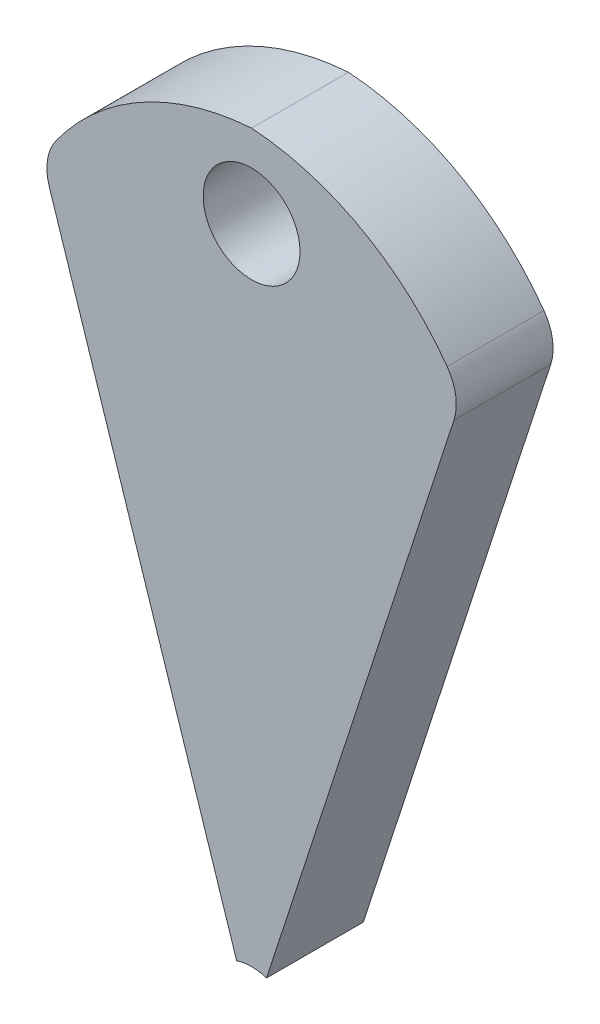
ISO-10303-21;
HEADER;
FILE_DESCRIPTION(('STEP AP214'),'2;1');
FILE_NAME('part.step','',(''),(''),'','','');
FILE_SCHEMA(('AUTOMOTIVE_DESIGN { 1 0 10303 214 1 1 1 1 }'));
ENDSEC;
DATA;
#1=APPLICATION_CONTEXT('core data for automotive mechanical design processes');
#2=APPLICATION_PROTOCOL_DEFINITION('international standard','automotive_design',2000,#1);
#3=PRODUCT_CONTEXT('',#1,'mechanical');
#4=PRODUCT('Part','Part','',(#3));
#5=PRODUCT_RELATED_PRODUCT_CATEGORY('part','',(#4));
#6=PRODUCT_DEFINITION_FORMATION('','',#4);
#7=PRODUCT_DEFINITION_CONTEXT('part definition',#1,'design');
#8=PRODUCT_DEFINITION('design','',#6,#7);
#9=PRODUCT_DEFINITION_SHAPE('','',#8);
#10=(LENGTH_UNIT() NAMED_UNIT(*) SI_UNIT(.MILLI.,.METRE.));
#11=(NAMED_UNIT(*) PLANE_ANGLE_UNIT() SI_UNIT($,.RADIAN.));
#12=(NAMED_UNIT(*) SI_UNIT($,.STERADIAN.) SOLID_ANGLE_UNIT());
#13=UNCERTAINTY_MEASURE_WITH_UNIT(LENGTH_MEASURE(1.E-05),#10,'distance_accuracy_value','');
#14=(GEOMETRIC_REPRESENTATION_CONTEXT(3) GLOBAL_UNCERTAINTY_ASSIGNED_CONTEXT((#13)) GLOBAL_UNIT_ASSIGNED_CONTEXT((#10,
#11,#12)) REPRESENTATION_CONTEXT('',''));
#15=CARTESIAN_POINT('',(0.,0.,0.));
#16=DIRECTION('',(0.,0.,1.));
#17=DIRECTION('',(1.,0.,0.));
#18=AXIS2_PLACEMENT_3D('',#15,#16,#17);
#19=CARTESIAN_POINT('',(12.1057873224374,508.853560240207,53.3781366448785));
#20=DIRECTION('',(0.,0.,-1.));
#21=DIRECTION('',(-1.,0.,0.));
#22=AXIS2_PLACEMENT_3D('',#19,#20,#21);
#23=PLANE('',#22);
#24=CARTESIAN_POINT('',(12.1057873224374,508.853560240207,53.3781366448785));
#25=DIRECTION('',(0.,0.,1.));
#26=DIRECTION('',(-1.,0.,0.));
#27=AXIS2_PLACEMENT_3D('',#24,#25,#26);
#28=CIRCLE('',#27,3.75);
#29=CARTESIAN_POINT('',(15.6722492585442,507.694746511301,53.3781366448785));
#30=VERTEX_POINT('',#29);
#31=CARTESIAN_POINT('',(15.1476526558998,511.046630073358,53.3781366448785));
#32=VERTEX_POINT('',#31);
#33=EDGE_CURVE('E160',#30,#32,#28,.T.);
#34=ORIENTED_EDGE('',*,*,#33,.T.);
#35=CARTESIAN_POINT('',(-1.38283151712811,499.128776324721,53.3781366448785));
#36=DIRECTION('',(0.,0.,1.));
#37=DIRECTION('',(1.,0.,0.));
#38=AXIS2_PLACEMENT_3D('',#35,#36,#37);
#39=CIRCLE('',#38,20.3787179422221);
#40=CARTESIAN_POINT('',(0.,519.460522977772,53.3781366448785));
#41=VERTEX_POINT('',#40);
#42=EDGE_CURVE('E102',#32,#41,#39,.T.);
#43=ORIENTED_EDGE('',*,*,#42,.T.);
#44=CARTESIAN_POINT('',(1.38283151712811,499.128776324721,53.3781366448785));
#45=DIRECTION('',(0.,0.,1.));
#46=DIRECTION('',(-1.,0.,0.));
#47=AXIS2_PLACEMENT_3D('',#44,#45,#46);
#48=CIRCLE('',#47,20.3787179422221);
#49=CARTESIAN_POINT('',(-15.1476526558998,511.046630073358,53.3781366448785));
#50=VERTEX_POINT('',#49);
#51=EDGE_CURVE('E192',#41,#50,#48,.T.);
#52=ORIENTED_EDGE('',*,*,#51,.T.);
#53=CARTESIAN_POINT('',(-12.1057873224373,508.853560240207,53.3781366448785));
#54=DIRECTION('',(0.,0.,1.));
#55=DIRECTION('',(1.,0.,0.));
#56=AXIS2_PLACEMENT_3D('',#53,#54,#55);
#57=CIRCLE('',#56,3.75);
#58=CARTESIAN_POINT('',(-15.6722492585442,507.694746511301,53.3781366448785));
#59=VERTEX_POINT('',#58);
#60=EDGE_CURVE('E118',#50,#59,#57,.T.);
#61=ORIENTED_EDGE('',*,*,#60,.T.);
#62=DIRECTION('',(0.309016994374948,-0.951056516295153,0.));
#63=VECTOR('',#62,1.);
#64=CARTESIAN_POINT('',(-1.15881372890605,463.026984913879,53.3781366448785));
#65=LINE('',#64,#63);
#66=CARTESIAN_POINT('',(-1.15881372890605,463.026984913879,53.3781366448785));
#67=VERTEX_POINT('',#66);
#68=EDGE_CURVE('E112',#59,#67,#65,.T.);
#69=ORIENTED_EDGE('',*,*,#68,.T.);
#70=CARTESIAN_POINT('',(0.,459.460522977772,53.3781366448785));
#71=DIRECTION('',(0.,0.,-1.));
#72=DIRECTION('',(1.,0.,0.));
#73=AXIS2_PLACEMENT_3D('',#70,#71,#72);
#74=CIRCLE('',#73,3.75);
#75=CARTESIAN_POINT('',(1.15881372890606,463.026984913879,53.3781366448785));
#76=VERTEX_POINT('',#75);
#77=EDGE_CURVE('E116',#67,#76,#74,.T.);
#78=ORIENTED_EDGE('',*,*,#77,.T.);
#79=DIRECTION('',(0.309016994374948,0.951056516295153,0.));
#80=VECTOR('',#79,1.);
#81=CARTESIAN_POINT('',(1.15881372890606,463.026984913879,53.3781366448785));
#82=LINE('',#81,#80);
#83=EDGE_CURVE('E61',#76,#30,#82,.T.);
#84=ORIENTED_EDGE('',*,*,#83,.T.);
#85=EDGE_LOOP('',(#34,#43,#52,#61,#69,#78,#84));
#86=FACE_BOUND('',#85,.T.);
#87=CARTESIAN_POINT('',(0.,513.039772977772,53.3781366448785));
#88=DIRECTION('',(0.,0.,1.));
#89=DIRECTION('',(1.,0.,0.));
#90=AXIS2_PLACEMENT_3D('',#87,#88,#89);
#91=CIRCLE('',#90,3.75);
#92=CARTESIAN_POINT('',(3.75,513.039772977772,53.3781366448785));
#93=VERTEX_POINT('',#92);
#94=EDGE_CURVE('E145',#93,#93,#91,.T.);
#95=ORIENTED_EDGE('',*,*,#94,.F.);
#96=EDGE_LOOP('',(#95));
#97=FACE_BOUND('',#96,.T.);
#98=ADVANCED_FACE('F43',(#86,#97),#23,.F.);
#99=CARTESIAN_POINT('',(12.1057873224374,508.853560240207,45.8781366448785));
#100=DIRECTION('',(0.,0.,-1.));
#101=DIRECTION('',(-1.,0.,0.));
#102=AXIS2_PLACEMENT_3D('',#99,#100,#101);
#103=PLANE('',#102);
#104=CARTESIAN_POINT('',(0.,506.710522977772,45.8781366448785));
#105=DIRECTION('',(0.,0.,-1.));
#106=DIRECTION('',(-1.,0.,0.));
#107=AXIS2_PLACEMENT_3D('',#104,#105,#106);
#108=CIRCLE('',#107,1.125);
#109=CARTESIAN_POINT('',(-1.125,506.710522977772,45.8781366448785));
#110=VERTEX_POINT('',#109);
#111=EDGE_CURVE('E11',#110,#110,#108,.T.);
#112=ORIENTED_EDGE('',*,*,#111,.F.);
#113=EDGE_LOOP('',(#112));
#114=FACE_BOUND('',#113,.T.);
#115=CARTESIAN_POINT('',(12.1057873224374,508.853560240207,45.8781366448785));
#116=DIRECTION('',(0.,0.,1.));
#117=DIRECTION('',(-1.,0.,0.));
#118=AXIS2_PLACEMENT_3D('',#115,#116,#117);
#119=CIRCLE('',#118,3.75);
#120=CARTESIAN_POINT('',(15.6722492585442,507.694746511301,45.8781366448785));
#121=VERTEX_POINT('',#120);
#122=CARTESIAN_POINT('',(15.1476526558998,511.046630073358,45.8781366448785));
#123=VERTEX_POINT('',#122);
#124=EDGE_CURVE('E140',#121,#123,#119,.T.);
#125=ORIENTED_EDGE('',*,*,#124,.F.);
#126=DIRECTION('',(0.309016994374948,0.951056516295153,0.));
#127=VECTOR('',#126,1.);
#128=CARTESIAN_POINT('',(1.15881372890606,463.026984913879,45.8781366448785));
#129=LINE('',#128,#127);
#130=CARTESIAN_POINT('',(1.15881372890606,463.026984913879,45.8781366448785));
#131=VERTEX_POINT('',#130);
#132=EDGE_CURVE('E93',#131,#121,#129,.T.);
#133=ORIENTED_EDGE('',*,*,#132,.F.);
#134=CARTESIAN_POINT('',(0.,459.460522977772,45.8781366448785));
#135=DIRECTION('',(0.,0.,-1.));
#136=DIRECTION('',(1.,0.,0.));
#137=AXIS2_PLACEMENT_3D('',#134,#135,#136);
#138=CIRCLE('',#137,3.75);
#139=CARTESIAN_POINT('',(-1.15881372890605,463.026984913879,45.8781366448785));
#140=VERTEX_POINT('',#139);
#141=EDGE_CURVE('E87',#140,#131,#138,.T.);
#142=ORIENTED_EDGE('',*,*,#141,.F.);
#143=DIRECTION('',(0.309016994374948,-0.951056516295153,0.));
#144=VECTOR('',#143,1.);
#145=CARTESIAN_POINT('',(-1.15881372890605,463.026984913879,45.8781366448785));
#146=LINE('',#145,#144);
#147=CARTESIAN_POINT('',(-15.6722492585442,507.694746511301,45.8781366448785));
#148=VERTEX_POINT('',#147);
#149=EDGE_CURVE('E127',#148,#140,#146,.T.);
#150=ORIENTED_EDGE('',*,*,#149,.F.);
#151=CARTESIAN_POINT('',(-12.1057873224373,508.853560240207,45.8781366448785));
#152=DIRECTION('',(0.,0.,1.));
#153=DIRECTION('',(1.,0.,0.));
#154=AXIS2_PLACEMENT_3D('',#151,#152,#153);
#155=CIRCLE('',#154,3.75);
#156=CARTESIAN_POINT('',(-15.1476526558998,511.046630073358,45.8781366448785));
#157=VERTEX_POINT('',#156);
#158=EDGE_CURVE('E151',#157,#148,#155,.T.);
#159=ORIENTED_EDGE('',*,*,#158,.F.);
#160=CARTESIAN_POINT('',(1.38283151712811,499.128776324721,45.8781366448785));
#161=DIRECTION('',(0.,0.,1.));
#162=DIRECTION('',(-1.,0.,0.));
#163=AXIS2_PLACEMENT_3D('',#160,#161,#162);
#164=CIRCLE('',#163,20.3787179422221);
#165=CARTESIAN_POINT('',(0.,519.460522977772,45.8781366448785));
#166=VERTEX_POINT('',#165);
#167=EDGE_CURVE('E148',#166,#157,#164,.T.);
#168=ORIENTED_EDGE('',*,*,#167,.F.);
#169=CARTESIAN_POINT('',(-1.38283151712811,499.128776324721,45.8781366448785));
#170=DIRECTION('',(0.,0.,1.));
#171=DIRECTION('',(1.,0.,0.));
#172=AXIS2_PLACEMENT_3D('',#169,#170,#171);
#173=CIRCLE('',#172,20.3787179422221);
#174=EDGE_CURVE('E144',#123,#166,#173,.T.);
#175=ORIENTED_EDGE('',*,*,#174,.F.);
#176=EDGE_LOOP('',(#125,#133,#142,#150,#159,#168,#175));
#177=FACE_BOUND('',#176,.T.);
#178=CARTESIAN_POINT('',(0.,513.039772977772,45.8781366448785));
#179=DIRECTION('',(0.,0.,1.));
#180=DIRECTION('',(1.,0.,0.));
#181=AXIS2_PLACEMENT_3D('',#178,#179,#180);
#182=CIRCLE('',#181,3.75);
#183=CARTESIAN_POINT('',(3.75,513.039772977772,45.8781366448785));
#184=VERTEX_POINT('',#183);
#185=EDGE_CURVE('E200',#184,#184,#182,.T.);
#186=ORIENTED_EDGE('',*,*,#185,.T.);
#187=EDGE_LOOP('',(#186));
#188=FACE_BOUND('',#187,.T.);
#189=ADVANCED_FACE('F181',(#114,#177,#188),#103,.T.);
#190=CARTESIAN_POINT('',(12.1057873224374,508.853560240207,53.3781366448785));
#191=DIRECTION('',(0.,0.,-1.));
#192=DIRECTION('',(-1.,0.,0.));
#193=AXIS2_PLACEMENT_3D('',#190,#191,#192);
#194=CYLINDRICAL_SURFACE('',#193,3.75);
#195=ORIENTED_EDGE('',*,*,#124,.T.);
#196=DIRECTION('',(0.,0.,-1.));
#197=VECTOR('',#196,1.);
#198=CARTESIAN_POINT('',(15.1476526558998,511.046630073358,53.3781366448785));
#199=LINE('',#198,#197);
#200=EDGE_CURVE('E53',#32,#123,#199,.T.);
#201=ORIENTED_EDGE('',*,*,#200,.F.);
#202=ORIENTED_EDGE('',*,*,#33,.F.);
#203=DIRECTION('',(0.,0.,-1.));
#204=VECTOR('',#203,1.);
#205=CARTESIAN_POINT('',(15.6722492585442,507.694746511301,53.3781366448785));
#206=LINE('',#205,#204);
#207=EDGE_CURVE('E136',#30,#121,#206,.T.);
#208=ORIENTED_EDGE('',*,*,#207,.T.);
#209=EDGE_LOOP('',(#195,#201,#202,#208));
#210=FACE_BOUND('',#209,.T.);
#211=ADVANCED_FACE('F45',(#210),#194,.T.);
#212=CARTESIAN_POINT('',(-1.38283151712811,499.128776324721,53.3781366448785));
#213=DIRECTION('',(0.,0.,-1.));
#214=DIRECTION('',(-1.,0.,0.));
#215=AXIS2_PLACEMENT_3D('',#212,#213,#214);
#216=CYLINDRICAL_SURFACE('',#215,20.3787179422221);
#217=ORIENTED_EDGE('',*,*,#174,.T.);
#218=DIRECTION('',(0.,0.,-1.));
#219=VECTOR('',#218,1.);
#220=CARTESIAN_POINT('',(0.,519.460522977772,53.3781366448785));
#221=LINE('',#220,#219);
#222=EDGE_CURVE('E171',#41,#166,#221,.T.);
#223=ORIENTED_EDGE('',*,*,#222,.F.);
#224=ORIENTED_EDGE('',*,*,#42,.F.);
#225=ORIENTED_EDGE('',*,*,#200,.T.);
#226=EDGE_LOOP('',(#217,#223,#224,#225));
#227=FACE_BOUND('',#226,.T.);
#228=ADVANCED_FACE('F176',(#227),#216,.T.);
#229=CARTESIAN_POINT('',(1.38283151712811,499.128776324721,53.3781366448785));
#230=DIRECTION('',(0.,0.,-1.));
#231=DIRECTION('',(-1.,0.,0.));
#232=AXIS2_PLACEMENT_3D('',#229,#230,#231);
#233=CYLINDRICAL_SURFACE('',#232,20.3787179422221);
#234=ORIENTED_EDGE('',*,*,#167,.T.);
#235=DIRECTION('',(0.,0.,-1.));
#236=VECTOR('',#235,1.);
#237=CARTESIAN_POINT('',(-15.1476526558998,511.046630073358,53.3781366448785));
#238=LINE('',#237,#236);
#239=EDGE_CURVE('E167',#50,#157,#238,.T.);
#240=ORIENTED_EDGE('',*,*,#239,.F.);
#241=ORIENTED_EDGE('',*,*,#51,.F.);
#242=ORIENTED_EDGE('',*,*,#222,.T.);
#243=EDGE_LOOP('',(#234,#240,#241,#242));
#244=FACE_BOUND('',#243,.T.);
#245=ADVANCED_FACE('F187',(#244),#233,.T.);
#246=CARTESIAN_POINT('',(-12.1057873224373,508.853560240207,53.3781366448785));
#247=DIRECTION('',(0.,0.,-1.));
#248=DIRECTION('',(-1.,0.,0.));
#249=AXIS2_PLACEMENT_3D('',#246,#247,#248);
#250=CYLINDRICAL_SURFACE('',#249,3.75);
#251=ORIENTED_EDGE('',*,*,#158,.T.);
#252=DIRECTION('',(0.,0.,-1.));
#253=VECTOR('',#252,1.);
#254=CARTESIAN_POINT('',(-15.6722492585442,507.694746511301,53.3781366448785));
#255=LINE('',#254,#253);
#256=EDGE_CURVE('E129',#59,#148,#255,.T.);
#257=ORIENTED_EDGE('',*,*,#256,.F.);
#258=ORIENTED_EDGE('',*,*,#60,.F.);
#259=ORIENTED_EDGE('',*,*,#239,.T.);
#260=EDGE_LOOP('',(#251,#257,#258,#259));
#261=FACE_BOUND('',#260,.T.);
#262=ADVANCED_FACE('F190',(#261),#250,.T.);
#263=CARTESIAN_POINT('',(-1.15881372890605,463.026984913879,53.3781366448785));
#264=DIRECTION('',(0.951056516295153,0.309016994374948,0.));
#265=DIRECTION('',(-0.309016994374948,0.951056516295153,0.));
#266=AXIS2_PLACEMENT_3D('',#263,#264,#265);
#267=PLANE('',#266);
#268=ORIENTED_EDGE('',*,*,#149,.T.);
#269=DIRECTION('',(0.,0.,-1.));
#270=VECTOR('',#269,1.);
#271=CARTESIAN_POINT('',(-1.15881372890605,463.026984913879,53.3781366448785));
#272=LINE('',#271,#270);
#273=EDGE_CURVE('E124',#67,#140,#272,.T.);
#274=ORIENTED_EDGE('',*,*,#273,.F.);
#275=ORIENTED_EDGE('',*,*,#68,.F.);
#276=ORIENTED_EDGE('',*,*,#256,.T.);
#277=EDGE_LOOP('',(#268,#274,#275,#276));
#278=FACE_BOUND('',#277,.T.);
#279=ADVANCED_FACE('F125',(#278),#267,.F.);
#280=CARTESIAN_POINT('',(0.,459.460522977772,53.3781366448785));
#281=DIRECTION('',(0.,0.,-1.));
#282=DIRECTION('',(-1.,0.,0.));
#283=AXIS2_PLACEMENT_3D('',#280,#281,#282);
#284=CYLINDRICAL_SURFACE('',#283,3.75);
#285=ORIENTED_EDGE('',*,*,#141,.T.);
#286=DIRECTION('',(0.,0.,-1.));
#287=VECTOR('',#286,1.);
#288=CARTESIAN_POINT('',(1.15881372890606,463.026984913879,53.3781366448785));
#289=LINE('',#288,#287);
#290=EDGE_CURVE('E130',#76,#131,#289,.T.);
#291=ORIENTED_EDGE('',*,*,#290,.F.);
#292=ORIENTED_EDGE('',*,*,#77,.F.);
#293=ORIENTED_EDGE('',*,*,#273,.T.);
#294=EDGE_LOOP('',(#285,#291,#292,#293));
#295=FACE_BOUND('',#294,.T.);
#296=ADVANCED_FACE('F132',(#295),#284,.F.);
#297=CARTESIAN_POINT('',(1.15881372890606,463.026984913879,53.3781366448785));
#298=DIRECTION('',(-0.951056516295153,0.309016994374948,0.));
#299=DIRECTION('',(-0.309016994374948,-0.951056516295153,0.));
#300=AXIS2_PLACEMENT_3D('',#297,#298,#299);
#301=PLANE('',#300);
#302=ORIENTED_EDGE('',*,*,#132,.T.);
#303=ORIENTED_EDGE('',*,*,#207,.F.);
#304=ORIENTED_EDGE('',*,*,#83,.F.);
#305=ORIENTED_EDGE('',*,*,#290,.T.);
#306=EDGE_LOOP('',(#302,#303,#304,#305));
#307=FACE_BOUND('',#306,.T.);
#308=ADVANCED_FACE('F232',(#307),#301,.F.);
#309=CARTESIAN_POINT('',(0.,513.039772977772,53.3781366448785));
#310=DIRECTION('',(0.,0.,-1.));
#311=DIRECTION('',(-1.,0.,0.));
#312=AXIS2_PLACEMENT_3D('',#309,#310,#311);
#313=CYLINDRICAL_SURFACE('',#312,3.75);
#314=ORIENTED_EDGE('',*,*,#94,.T.);
#315=EDGE_LOOP('',(#314));
#316=FACE_BOUND('',#315,.T.);
#317=ORIENTED_EDGE('',*,*,#185,.F.);
#318=EDGE_LOOP('',(#317));
#319=FACE_BOUND('',#318,.T.);
#320=ADVANCED_FACE('F221',(#316,#319),#313,.F.);
#321=CARTESIAN_POINT('',(0.,506.710522977772,38.3781366448785));
#322=DIRECTION('',(0.,0.,1.));
#323=DIRECTION('',(1.,0.,0.));
#324=AXIS2_PLACEMENT_3D('',#321,#322,#323);
#325=CYLINDRICAL_SURFACE('',#324,1.125);
#326=CARTESIAN_POINT('',(0.,506.710522977772,38.3781366448785));
#327=DIRECTION('',(0.,0.,1.));
#328=DIRECTION('',(1.,0.,0.));
#329=AXIS2_PLACEMENT_3D('',#326,#327,#328);
#330=CIRCLE('',#329,1.125);
#331=CARTESIAN_POINT('',(1.125,506.710522977772,38.3781366448785));
#332=VERTEX_POINT('',#331);
#333=EDGE_CURVE('E204',#332,#332,#330,.T.);
#334=ORIENTED_EDGE('',*,*,#333,.T.);
#335=EDGE_LOOP('',(#334));
#336=FACE_BOUND('',#335,.T.);
#337=ORIENTED_EDGE('',*,*,#111,.T.);
#338=EDGE_LOOP('',(#337));
#339=FACE_BOUND('',#338,.T.);
#340=ADVANCED_FACE('F212',(#336,#339),#325,.T.);
#341=CARTESIAN_POINT('',(0.,506.710522977772,38.3781366448785));
#342=DIRECTION('',(0.,0.,1.));
#343=DIRECTION('',(1.,0.,0.));
#344=AXIS2_PLACEMENT_3D('',#341,#342,#343);
#345=PLANE('',#344);
#346=ORIENTED_EDGE('',*,*,#333,.F.);
#347=EDGE_LOOP('',(#346));
#348=FACE_BOUND('',#347,.T.);
#349=ADVANCED_FACE('F215',(#348),#345,.F.);
#350=CLOSED_SHELL('',(#98,#189,#211,#228,#245,#262,#279,#296,#308,#320,#340,#349));
#351=MANIFOLD_SOLID_BREP('B2',#350);
#352=ADVANCED_BREP_SHAPE_REPRESENTATION('',(#18,#351),#14);
#353=SHAPE_DEFINITION_REPRESENTATION(#9,#352);
ENDSEC;
END-ISO-10303-21;
